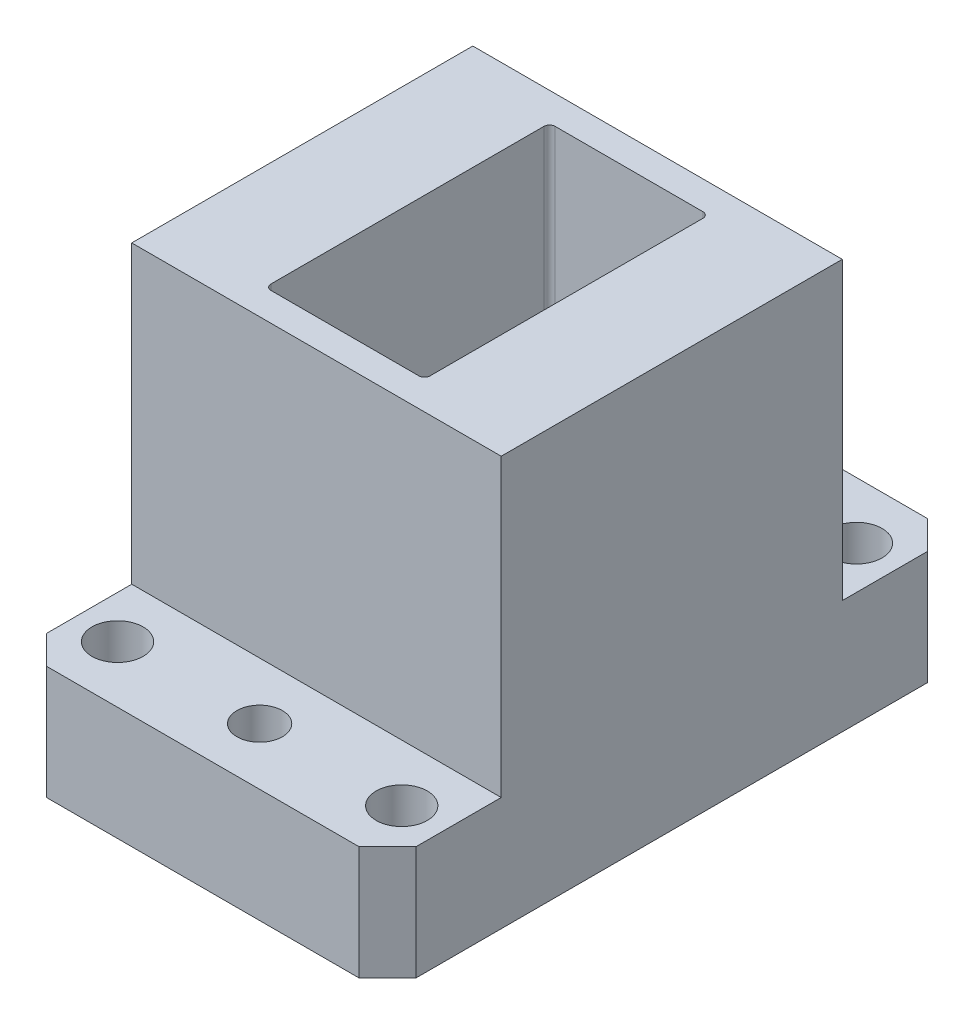
ISO-10303-21;
HEADER;
FILE_DESCRIPTION(('STEP AP214'),'2;1');
FILE_NAME('part.step','',(''),(''),'','','');
FILE_SCHEMA(('AUTOMOTIVE_DESIGN { 1 0 10303 214 1 1 1 1 }'));
ENDSEC;
DATA;
#1=APPLICATION_CONTEXT('core data for automotive mechanical design processes');
#2=APPLICATION_PROTOCOL_DEFINITION('international standard','automotive_design',2000,#1);
#3=PRODUCT_CONTEXT('',#1,'mechanical');
#4=PRODUCT('Part','Part','',(#3));
#5=PRODUCT_RELATED_PRODUCT_CATEGORY('part','',(#4));
#6=PRODUCT_DEFINITION_FORMATION('','',#4);
#7=PRODUCT_DEFINITION_CONTEXT('part definition',#1,'design');
#8=PRODUCT_DEFINITION('design','',#6,#7);
#9=PRODUCT_DEFINITION_SHAPE('','',#8);
#10=(LENGTH_UNIT() NAMED_UNIT(*) SI_UNIT(.MILLI.,.METRE.));
#11=(NAMED_UNIT(*) PLANE_ANGLE_UNIT() SI_UNIT($,.RADIAN.));
#12=(NAMED_UNIT(*) SI_UNIT($,.STERADIAN.) SOLID_ANGLE_UNIT());
#13=UNCERTAINTY_MEASURE_WITH_UNIT(LENGTH_MEASURE(1.E-05),#10,'distance_accuracy_value','');
#14=(GEOMETRIC_REPRESENTATION_CONTEXT(3) GLOBAL_UNCERTAINTY_ASSIGNED_CONTEXT((#13)) GLOBAL_UNIT_ASSIGNED_CONTEXT((#10,
#11,#12)) REPRESENTATION_CONTEXT('',''));
#15=CARTESIAN_POINT('',(0.,0.,0.));
#16=DIRECTION('',(0.,0.,1.));
#17=DIRECTION('',(1.,0.,0.));
#18=AXIS2_PLACEMENT_3D('',#15,#16,#17);
#19=CARTESIAN_POINT('',(-32.5,-16.,-50.));
#20=DIRECTION('',(0.,-1.,0.));
#21=DIRECTION('',(0.,0.,-1.));
#22=AXIS2_PLACEMENT_3D('',#19,#20,#21);
#23=PLANE('',#22);
#24=CARTESIAN_POINT('',(0.,-16.,-40.));
#25=DIRECTION('',(0.,1.,0.));
#26=DIRECTION('',(0.,0.,1.));
#27=AXIS2_PLACEMENT_3D('',#24,#25,#26);
#28=CIRCLE('',#27,4.);
#29=CARTESIAN_POINT('',(0.,-16.,-36.));
#30=VERTEX_POINT('',#29);
#31=EDGE_CURVE('E523',#30,#30,#28,.T.);
#32=ORIENTED_EDGE('',*,*,#31,.F.);
#33=EDGE_LOOP('',(#32));
#34=FACE_BOUND('',#33,.T.);
#35=CARTESIAN_POINT('',(-25.,-16.,-40.));
#36=DIRECTION('',(0.,1.,0.));
#37=DIRECTION('',(0.,0.,1.));
#38=AXIS2_PLACEMENT_3D('',#35,#36,#37);
#39=CIRCLE('',#38,4.49999999999999);
#40=CARTESIAN_POINT('',(-25.,-16.,-35.5));
#41=VERTEX_POINT('',#40);
#42=EDGE_CURVE('E514',#41,#41,#39,.T.);
#43=ORIENTED_EDGE('',*,*,#42,.F.);
#44=EDGE_LOOP('',(#43));
#45=FACE_BOUND('',#44,.T.);
#46=DIRECTION('',(-1.,0.,0.));
#47=VECTOR('',#46,1.);
#48=CARTESIAN_POINT('',(32.5,-16.,-50.));
#49=LINE('',#48,#47);
#50=CARTESIAN_POINT('',(27.5,-16.,-50.));
#51=VERTEX_POINT('',#50);
#52=CARTESIAN_POINT('',(-27.5,-16.,-50.));
#53=VERTEX_POINT('',#52);
#54=EDGE_CURVE('E185',#51,#53,#49,.T.);
#55=ORIENTED_EDGE('',*,*,#54,.T.);
#56=DIRECTION('',(0.70710678118655,0.,-0.707106781186546));
#57=VECTOR('',#56,1.);
#58=CARTESIAN_POINT('',(-32.5,-16.,-45.));
#59=LINE('',#58,#57);
#60=CARTESIAN_POINT('',(-32.5,-16.,-45.));
#61=VERTEX_POINT('',#60);
#62=EDGE_CURVE('E180',#53,#61,#59,.F.);
#63=ORIENTED_EDGE('',*,*,#62,.T.);
#64=DIRECTION('',(0.,0.,1.));
#65=VECTOR('',#64,1.);
#66=CARTESIAN_POINT('',(-32.5,-16.,-30.));
#67=LINE('',#66,#65);
#68=CARTESIAN_POINT('',(-32.5,-16.,-30.));
#69=VERTEX_POINT('',#68);
#70=EDGE_CURVE('E172',#61,#69,#67,.T.);
#71=ORIENTED_EDGE('',*,*,#70,.T.);
#72=DIRECTION('',(1.,0.,0.));
#73=VECTOR('',#72,1.);
#74=CARTESIAN_POINT('',(-32.5,-16.,-30.));
#75=LINE('',#74,#73);
#76=CARTESIAN_POINT('',(32.5,-16.,-30.));
#77=VERTEX_POINT('',#76);
#78=EDGE_CURVE('E177',#69,#77,#75,.T.);
#79=ORIENTED_EDGE('',*,*,#78,.T.);
#80=DIRECTION('',(0.,0.,-1.));
#81=VECTOR('',#80,1.);
#82=CARTESIAN_POINT('',(32.5,-16.,-30.));
#83=LINE('',#82,#81);
#84=CARTESIAN_POINT('',(32.5,-16.,-45.));
#85=VERTEX_POINT('',#84);
#86=EDGE_CURVE('E193',#77,#85,#83,.T.);
#87=ORIENTED_EDGE('',*,*,#86,.T.);
#88=DIRECTION('',(0.70710678118655,0.,0.707106781186546));
#89=VECTOR('',#88,1.);
#90=CARTESIAN_POINT('',(32.5,-16.,-45.));
#91=LINE('',#90,#89);
#92=EDGE_CURVE('E275',#85,#51,#91,.F.);
#93=ORIENTED_EDGE('',*,*,#92,.T.);
#94=EDGE_LOOP('',(#55,#63,#71,#79,#87,#93));
#95=FACE_BOUND('',#94,.T.);
#96=CARTESIAN_POINT('',(25.,-16.,-40.));
#97=DIRECTION('',(0.,1.,0.));
#98=DIRECTION('',(0.,0.,1.));
#99=AXIS2_PLACEMENT_3D('',#96,#97,#98);
#100=CIRCLE('',#99,4.49999999999999);
#101=CARTESIAN_POINT('',(25.,-16.,-35.5));
#102=VERTEX_POINT('',#101);
#103=EDGE_CURVE('E471',#102,#102,#100,.T.);
#104=ORIENTED_EDGE('',*,*,#103,.F.);
#105=EDGE_LOOP('',(#104));
#106=FACE_BOUND('',#105,.T.);
#107=ADVANCED_FACE('F34',(#34,#45,#95,#106),#23,.F.);
#108=CARTESIAN_POINT('',(-32.5,-16.,30.));
#109=DIRECTION('',(0.,-1.,0.));
#110=DIRECTION('',(0.,0.,-1.));
#111=AXIS2_PLACEMENT_3D('',#108,#109,#110);
#112=PLANE('',#111);
#113=CARTESIAN_POINT('',(0.,-16.,40.));
#114=DIRECTION('',(0.,1.,0.));
#115=DIRECTION('',(0.,0.,1.));
#116=AXIS2_PLACEMENT_3D('',#113,#114,#115);
#117=CIRCLE('',#116,4.);
#118=CARTESIAN_POINT('',(0.,-16.,44.));
#119=VERTEX_POINT('',#118);
#120=EDGE_CURVE('E517',#119,#119,#117,.T.);
#121=ORIENTED_EDGE('',*,*,#120,.F.);
#122=EDGE_LOOP('',(#121));
#123=FACE_BOUND('',#122,.T.);
#124=CARTESIAN_POINT('',(25.,-16.,40.));
#125=DIRECTION('',(0.,1.,0.));
#126=DIRECTION('',(0.,0.,1.));
#127=AXIS2_PLACEMENT_3D('',#124,#125,#126);
#128=CIRCLE('',#127,4.49999999999999);
#129=CARTESIAN_POINT('',(25.,-16.,44.5));
#130=VERTEX_POINT('',#129);
#131=EDGE_CURVE('E464',#130,#130,#128,.T.);
#132=ORIENTED_EDGE('',*,*,#131,.F.);
#133=EDGE_LOOP('',(#132));
#134=FACE_BOUND('',#133,.T.);
#135=DIRECTION('',(0.,0.,1.));
#136=VECTOR('',#135,1.);
#137=CARTESIAN_POINT('',(-32.5,-16.,50.));
#138=LINE('',#137,#136);
#139=CARTESIAN_POINT('',(-32.5,-16.,30.));
#140=VERTEX_POINT('',#139);
#141=CARTESIAN_POINT('',(-32.5,-16.,45.));
#142=VERTEX_POINT('',#141);
#143=EDGE_CURVE('E206',#140,#142,#138,.T.);
#144=ORIENTED_EDGE('',*,*,#143,.T.);
#145=DIRECTION('',(0.707106781186546,0.,0.70710678118655));
#146=VECTOR('',#145,1.);
#147=CARTESIAN_POINT('',(-27.5,-16.,50.));
#148=LINE('',#147,#146);
#149=CARTESIAN_POINT('',(-27.5,-16.,50.));
#150=VERTEX_POINT('',#149);
#151=EDGE_CURVE('E291',#142,#150,#148,.T.);
#152=ORIENTED_EDGE('',*,*,#151,.T.);
#153=DIRECTION('',(1.,0.,0.));
#154=VECTOR('',#153,1.);
#155=CARTESIAN_POINT('',(-32.5,-16.,50.));
#156=LINE('',#155,#154);
#157=CARTESIAN_POINT('',(27.5,-16.,50.));
#158=VERTEX_POINT('',#157);
#159=EDGE_CURVE('E209',#150,#158,#156,.T.);
#160=ORIENTED_EDGE('',*,*,#159,.T.);
#161=DIRECTION('',(0.707106781186546,0.,-0.70710678118655));
#162=VECTOR('',#161,1.);
#163=CARTESIAN_POINT('',(27.5,-16.,50.));
#164=LINE('',#163,#162);
#165=CARTESIAN_POINT('',(32.5,-16.,45.));
#166=VERTEX_POINT('',#165);
#167=EDGE_CURVE('E289',#158,#166,#164,.T.);
#168=ORIENTED_EDGE('',*,*,#167,.T.);
#169=DIRECTION('',(0.,0.,-1.));
#170=VECTOR('',#169,1.);
#171=CARTESIAN_POINT('',(32.5,-16.,50.));
#172=LINE('',#171,#170);
#173=CARTESIAN_POINT('',(32.5,-16.,30.));
#174=VERTEX_POINT('',#173);
#175=EDGE_CURVE('E212',#166,#174,#172,.T.);
#176=ORIENTED_EDGE('',*,*,#175,.T.);
#177=DIRECTION('',(-1.,0.,0.));
#178=VECTOR('',#177,1.);
#179=CARTESIAN_POINT('',(-32.5,-16.,30.));
#180=LINE('',#179,#178);
#181=EDGE_CURVE('E214',#174,#140,#180,.T.);
#182=ORIENTED_EDGE('',*,*,#181,.T.);
#183=EDGE_LOOP('',(#144,#152,#160,#168,#176,#182));
#184=FACE_BOUND('',#183,.T.);
#185=CARTESIAN_POINT('',(-25.,-16.,40.));
#186=DIRECTION('',(0.,1.,0.));
#187=DIRECTION('',(0.,0.,1.));
#188=AXIS2_PLACEMENT_3D('',#185,#186,#187);
#189=CIRCLE('',#188,4.49999999999999);
#190=CARTESIAN_POINT('',(-25.,-16.,44.5));
#191=VERTEX_POINT('',#190);
#192=EDGE_CURVE('E468',#191,#191,#189,.T.);
#193=ORIENTED_EDGE('',*,*,#192,.F.);
#194=EDGE_LOOP('',(#193));
#195=FACE_BOUND('',#194,.T.);
#196=ADVANCED_FACE('F365',(#123,#134,#184,#195),#112,.F.);
#197=CARTESIAN_POINT('',(-32.5,36.,50.));
#198=DIRECTION('',(1.,0.,0.));
#199=DIRECTION('',(0.,1.,0.));
#200=AXIS2_PLACEMENT_3D('',#197,#198,#199);
#201=PLANE('',#200);
#202=ORIENTED_EDGE('',*,*,#70,.F.);
#203=DIRECTION('',(0.,-1.,0.));
#204=VECTOR('',#203,1.);
#205=CARTESIAN_POINT('',(-32.5,36.,-45.));
#206=LINE('',#205,#204);
#207=CARTESIAN_POINT('',(-32.5,-36.,-45.));
#208=VERTEX_POINT('',#207);
#209=EDGE_CURVE('E261',#61,#208,#206,.T.);
#210=ORIENTED_EDGE('',*,*,#209,.T.);
#211=DIRECTION('',(0.,0.,-1.));
#212=VECTOR('',#211,1.);
#213=CARTESIAN_POINT('',(-32.5,-36.,50.));
#214=LINE('',#213,#212);
#215=CARTESIAN_POINT('',(-32.5,-36.,45.));
#216=VERTEX_POINT('',#215);
#217=EDGE_CURVE('E256',#216,#208,#214,.T.);
#218=ORIENTED_EDGE('',*,*,#217,.F.);
#219=DIRECTION('',(0.,1.,0.));
#220=VECTOR('',#219,1.);
#221=CARTESIAN_POINT('',(-32.5,-16.,45.));
#222=LINE('',#221,#220);
#223=EDGE_CURVE('E259',#216,#142,#222,.T.);
#224=ORIENTED_EDGE('',*,*,#223,.T.);
#225=ORIENTED_EDGE('',*,*,#143,.F.);
#226=DIRECTION('',(0.,1.,0.));
#227=VECTOR('',#226,1.);
#228=CARTESIAN_POINT('',(-32.5,-16.,30.));
#229=LINE('',#228,#227);
#230=CARTESIAN_POINT('',(-32.5,36.,30.));
#231=VERTEX_POINT('',#230);
#232=EDGE_CURVE('E219',#140,#231,#229,.T.);
#233=ORIENTED_EDGE('',*,*,#232,.T.);
#234=DIRECTION('',(0.,0.,-1.));
#235=VECTOR('',#234,1.);
#236=CARTESIAN_POINT('',(-32.5,36.,50.));
#237=LINE('',#236,#235);
#238=CARTESIAN_POINT('',(-32.5,36.,-30.));
#239=VERTEX_POINT('',#238);
#240=EDGE_CURVE('E199',#231,#239,#237,.T.);
#241=ORIENTED_EDGE('',*,*,#240,.T.);
#242=DIRECTION('',(0.,1.,0.));
#243=VECTOR('',#242,1.);
#244=CARTESIAN_POINT('',(-32.5,-16.,-30.));
#245=LINE('',#244,#243);
#246=EDGE_CURVE('E189',#69,#239,#245,.T.);
#247=ORIENTED_EDGE('',*,*,#246,.F.);
#248=EDGE_LOOP('',(#202,#210,#218,#224,#225,#233,#241,#247));
#249=FACE_BOUND('',#248,.T.);
#250=ADVANCED_FACE('F196',(#249),#201,.F.);
#251=CARTESIAN_POINT('',(-32.5,-36.,50.));
#252=DIRECTION('',(0.,1.,0.));
#253=DIRECTION('',(0.,0.,1.));
#254=AXIS2_PLACEMENT_3D('',#251,#252,#253);
#255=PLANE('',#254);
#256=CARTESIAN_POINT('',(0.,-36.,-40.));
#257=DIRECTION('',(0.,1.,0.));
#258=DIRECTION('',(0.,0.,1.));
#259=AXIS2_PLACEMENT_3D('',#256,#257,#258);
#260=CIRCLE('',#259,4.);
#261=CARTESIAN_POINT('',(0.,-36.,-36.));
#262=VERTEX_POINT('',#261);
#263=EDGE_CURVE('E526',#262,#262,#260,.T.);
#264=ORIENTED_EDGE('',*,*,#263,.T.);
#265=EDGE_LOOP('',(#264));
#266=FACE_BOUND('',#265,.T.);
#267=CARTESIAN_POINT('',(0.,-36.,40.));
#268=DIRECTION('',(0.,1.,0.));
#269=DIRECTION('',(0.,0.,1.));
#270=AXIS2_PLACEMENT_3D('',#267,#268,#269);
#271=CIRCLE('',#270,4.);
#272=CARTESIAN_POINT('',(0.,-36.,44.));
#273=VERTEX_POINT('',#272);
#274=EDGE_CURVE('E520',#273,#273,#271,.T.);
#275=ORIENTED_EDGE('',*,*,#274,.T.);
#276=EDGE_LOOP('',(#275));
#277=FACE_BOUND('',#276,.T.);
#278=CARTESIAN_POINT('',(-25.,-36.,-40.));
#279=DIRECTION('',(0.,1.,0.));
#280=DIRECTION('',(0.,0.,1.));
#281=AXIS2_PLACEMENT_3D('',#278,#279,#280);
#282=CIRCLE('',#281,4.49999999999999);
#283=CARTESIAN_POINT('',(-25.,-36.,-35.5));
#284=VERTEX_POINT('',#283);
#285=EDGE_CURVE('E511',#284,#284,#282,.T.);
#286=ORIENTED_EDGE('',*,*,#285,.T.);
#287=EDGE_LOOP('',(#286));
#288=FACE_BOUND('',#287,.T.);
#289=CARTESIAN_POINT('',(25.,-36.,-40.));
#290=DIRECTION('',(0.,1.,0.));
#291=DIRECTION('',(0.,0.,1.));
#292=AXIS2_PLACEMENT_3D('',#289,#290,#291);
#293=CIRCLE('',#292,4.49999999999999);
#294=CARTESIAN_POINT('',(25.,-36.,-35.5));
#295=VERTEX_POINT('',#294);
#296=EDGE_CURVE('E466',#295,#295,#293,.T.);
#297=ORIENTED_EDGE('',*,*,#296,.T.);
#298=EDGE_LOOP('',(#297));
#299=FACE_BOUND('',#298,.T.);
#300=CARTESIAN_POINT('',(25.,-36.,40.));
#301=DIRECTION('',(0.,1.,0.));
#302=DIRECTION('',(0.,0.,1.));
#303=AXIS2_PLACEMENT_3D('',#300,#301,#302);
#304=CIRCLE('',#303,4.49999999999999);
#305=CARTESIAN_POINT('',(25.,-36.,44.5));
#306=VERTEX_POINT('',#305);
#307=EDGE_CURVE('E461',#306,#306,#304,.T.);
#308=ORIENTED_EDGE('',*,*,#307,.T.);
#309=EDGE_LOOP('',(#308));
#310=FACE_BOUND('',#309,.T.);
#311=CARTESIAN_POINT('',(-25.,-36.,40.));
#312=DIRECTION('',(0.,1.,0.));
#313=DIRECTION('',(0.,0.,1.));
#314=AXIS2_PLACEMENT_3D('',#311,#312,#313);
#315=CIRCLE('',#314,4.49999999999999);
#316=CARTESIAN_POINT('',(-25.,-36.,44.5));
#317=VERTEX_POINT('',#316);
#318=EDGE_CURVE('E477',#317,#317,#315,.T.);
#319=ORIENTED_EDGE('',*,*,#318,.T.);
#320=EDGE_LOOP('',(#319));
#321=FACE_BOUND('',#320,.T.);
#322=DIRECTION('',(0.,0.,-1.));
#323=VECTOR('',#322,1.);
#324=CARTESIAN_POINT('',(13.9999999999999,-36.,-25.));
#325=LINE('',#324,#323);
#326=CARTESIAN_POINT('',(14.0000000000001,-36.,24.));
#327=VERTEX_POINT('',#326);
#328=CARTESIAN_POINT('',(13.9999999999999,-36.,-24.));
#329=VERTEX_POINT('',#328);
#330=EDGE_CURVE('E229',#327,#329,#325,.T.);
#331=ORIENTED_EDGE('',*,*,#330,.T.);
#332=CARTESIAN_POINT('',(12.9999999999999,-36.,-24.));
#333=DIRECTION('',(0.,1.,0.));
#334=DIRECTION('',(0.,0.,1.));
#335=AXIS2_PLACEMENT_3D('',#332,#333,#334);
#336=CIRCLE('',#335,1.);
#337=CARTESIAN_POINT('',(12.9999999999999,-36.,-25.));
#338=VERTEX_POINT('',#337);
#339=EDGE_CURVE('E314',#329,#338,#336,.T.);
#340=ORIENTED_EDGE('',*,*,#339,.T.);
#341=DIRECTION('',(-1.,0.,0.));
#342=VECTOR('',#341,1.);
#343=CARTESIAN_POINT('',(-14.0000000000001,-36.,-25.));
#344=LINE('',#343,#342);
#345=CARTESIAN_POINT('',(-13.0000000000001,-36.,-25.));
#346=VERTEX_POINT('',#345);
#347=EDGE_CURVE('E232',#338,#346,#344,.T.);
#348=ORIENTED_EDGE('',*,*,#347,.T.);
#349=CARTESIAN_POINT('',(-13.0000000000001,-36.,-24.));
#350=DIRECTION('',(0.,1.,0.));
#351=DIRECTION('',(0.,0.,1.));
#352=AXIS2_PLACEMENT_3D('',#349,#350,#351);
#353=CIRCLE('',#352,1.);
#354=CARTESIAN_POINT('',(-14.0000000000001,-36.,-24.));
#355=VERTEX_POINT('',#354);
#356=EDGE_CURVE('E56',#346,#355,#353,.T.);
#357=ORIENTED_EDGE('',*,*,#356,.T.);
#358=DIRECTION('',(0.,0.,1.));
#359=VECTOR('',#358,1.);
#360=CARTESIAN_POINT('',(-14.0000000000001,-36.,-25.));
#361=LINE('',#360,#359);
#362=CARTESIAN_POINT('',(-14.0000000000001,-36.,24.));
#363=VERTEX_POINT('',#362);
#364=EDGE_CURVE('E223',#355,#363,#361,.T.);
#365=ORIENTED_EDGE('',*,*,#364,.T.);
#366=CARTESIAN_POINT('',(-13.0000000000001,-36.,24.));
#367=DIRECTION('',(0.,1.,0.));
#368=DIRECTION('',(0.,0.,1.));
#369=AXIS2_PLACEMENT_3D('',#366,#367,#368);
#370=CIRCLE('',#369,1.);
#371=CARTESIAN_POINT('',(-13.0000000000001,-36.,25.));
#372=VERTEX_POINT('',#371);
#373=EDGE_CURVE('E11',#363,#372,#370,.T.);
#374=ORIENTED_EDGE('',*,*,#373,.T.);
#375=DIRECTION('',(1.,0.,0.));
#376=VECTOR('',#375,1.);
#377=CARTESIAN_POINT('',(-14.0000000000001,-36.,25.));
#378=LINE('',#377,#376);
#379=CARTESIAN_POINT('',(13.0000000000001,-36.,25.));
#380=VERTEX_POINT('',#379);
#381=EDGE_CURVE('E225',#372,#380,#378,.T.);
#382=ORIENTED_EDGE('',*,*,#381,.T.);
#383=CARTESIAN_POINT('',(13.0000000000001,-36.,24.));
#384=DIRECTION('',(0.,1.,0.));
#385=DIRECTION('',(0.,0.,1.));
#386=AXIS2_PLACEMENT_3D('',#383,#384,#385);
#387=CIRCLE('',#386,1.);
#388=EDGE_CURVE('E318',#380,#327,#387,.T.);
#389=ORIENTED_EDGE('',*,*,#388,.T.);
#390=EDGE_LOOP('',(#331,#340,#348,#357,#365,#374,#382,#389));
#391=FACE_BOUND('',#390,.T.);
#392=ORIENTED_EDGE('',*,*,#217,.T.);
#393=DIRECTION('',(-0.70710678118655,0.,0.707106781186546));
#394=VECTOR('',#393,1.);
#395=CARTESIAN_POINT('',(-32.5,-36.,-45.));
#396=LINE('',#395,#394);
#397=CARTESIAN_POINT('',(-27.5,-36.,-50.));
#398=VERTEX_POINT('',#397);
#399=EDGE_CURVE('E269',#208,#398,#396,.F.);
#400=ORIENTED_EDGE('',*,*,#399,.T.);
#401=DIRECTION('',(1.,0.,0.));
#402=VECTOR('',#401,1.);
#403=CARTESIAN_POINT('',(-32.5,-36.,-50.));
#404=LINE('',#403,#402);
#405=CARTESIAN_POINT('',(27.5,-36.,-50.));
#406=VERTEX_POINT('',#405);
#407=EDGE_CURVE('E234',#398,#406,#404,.T.);
#408=ORIENTED_EDGE('',*,*,#407,.T.);
#409=DIRECTION('',(-0.70710678118655,0.,-0.707106781186546));
#410=VECTOR('',#409,1.);
#411=CARTESIAN_POINT('',(32.5,-36.,-45.));
#412=LINE('',#411,#410);
#413=CARTESIAN_POINT('',(32.5,-36.,-45.));
#414=VERTEX_POINT('',#413);
#415=EDGE_CURVE('E267',#406,#414,#412,.F.);
#416=ORIENTED_EDGE('',*,*,#415,.T.);
#417=DIRECTION('',(0.,0.,-1.));
#418=VECTOR('',#417,1.);
#419=CARTESIAN_POINT('',(32.5,-36.,50.));
#420=LINE('',#419,#418);
#421=CARTESIAN_POINT('',(32.5,-36.,45.));
#422=VERTEX_POINT('',#421);
#423=EDGE_CURVE('E253',#422,#414,#420,.T.);
#424=ORIENTED_EDGE('',*,*,#423,.F.);
#425=DIRECTION('',(-0.707106781186546,0.,0.70710678118655));
#426=VECTOR('',#425,1.);
#427=CARTESIAN_POINT('',(27.5,-36.,50.));
#428=LINE('',#427,#426);
#429=CARTESIAN_POINT('',(27.5,-36.,50.));
#430=VERTEX_POINT('',#429);
#431=EDGE_CURVE('E263',#422,#430,#428,.T.);
#432=ORIENTED_EDGE('',*,*,#431,.T.);
#433=DIRECTION('',(1.,0.,0.));
#434=VECTOR('',#433,1.);
#435=CARTESIAN_POINT('',(-32.5,-36.,50.));
#436=LINE('',#435,#434);
#437=CARTESIAN_POINT('',(-27.5,-36.,50.));
#438=VERTEX_POINT('',#437);
#439=EDGE_CURVE('E244',#438,#430,#436,.T.);
#440=ORIENTED_EDGE('',*,*,#439,.F.);
#441=DIRECTION('',(-0.707106781186546,0.,-0.70710678118655));
#442=VECTOR('',#441,1.);
#443=CARTESIAN_POINT('',(-27.5,-36.,50.));
#444=LINE('',#443,#442);
#445=EDGE_CURVE('E265',#438,#216,#444,.T.);
#446=ORIENTED_EDGE('',*,*,#445,.T.);
#447=EDGE_LOOP('',(#392,#400,#408,#416,#424,#432,#440,#446));
#448=FACE_BOUND('',#447,.T.);
#449=ADVANCED_FACE('F333',(#266,#277,#288,#299,#310,#321,#391,#448),#255,.F.);
#450=CARTESIAN_POINT('',(32.5,36.,50.));
#451=DIRECTION('',(-1.,0.,0.));
#452=DIRECTION('',(0.,-1.,0.));
#453=AXIS2_PLACEMENT_3D('',#450,#451,#452);
#454=PLANE('',#453);
#455=ORIENTED_EDGE('',*,*,#423,.T.);
#456=DIRECTION('',(0.,1.,0.));
#457=VECTOR('',#456,1.);
#458=CARTESIAN_POINT('',(32.5,36.,-45.));
#459=LINE('',#458,#457);
#460=EDGE_CURVE('E280',#414,#85,#459,.T.);
#461=ORIENTED_EDGE('',*,*,#460,.T.);
#462=ORIENTED_EDGE('',*,*,#86,.F.);
#463=DIRECTION('',(0.,1.,0.));
#464=VECTOR('',#463,1.);
#465=CARTESIAN_POINT('',(32.5,-16.,-30.));
#466=LINE('',#465,#464);
#467=CARTESIAN_POINT('',(32.5,36.,-30.));
#468=VERTEX_POINT('',#467);
#469=EDGE_CURVE('E192',#77,#468,#466,.T.);
#470=ORIENTED_EDGE('',*,*,#469,.T.);
#471=DIRECTION('',(0.,0.,-1.));
#472=VECTOR('',#471,1.);
#473=CARTESIAN_POINT('',(32.5,36.,50.));
#474=LINE('',#473,#472);
#475=CARTESIAN_POINT('',(32.5,36.,30.));
#476=VERTEX_POINT('',#475);
#477=EDGE_CURVE('E250',#476,#468,#474,.T.);
#478=ORIENTED_EDGE('',*,*,#477,.F.);
#479=DIRECTION('',(0.,1.,0.));
#480=VECTOR('',#479,1.);
#481=CARTESIAN_POINT('',(32.5,-16.,30.));
#482=LINE('',#481,#480);
#483=EDGE_CURVE('E217',#174,#476,#482,.T.);
#484=ORIENTED_EDGE('',*,*,#483,.F.);
#485=ORIENTED_EDGE('',*,*,#175,.F.);
#486=DIRECTION('',(0.,-1.,0.));
#487=VECTOR('',#486,1.);
#488=CARTESIAN_POINT('',(32.5,-36.,45.));
#489=LINE('',#488,#487);
#490=EDGE_CURVE('E278',#166,#422,#489,.T.);
#491=ORIENTED_EDGE('',*,*,#490,.T.);
#492=EDGE_LOOP('',(#455,#461,#462,#470,#478,#484,#485,#491));
#493=FACE_BOUND('',#492,.T.);
#494=ADVANCED_FACE('F404',(#493),#454,.F.);
#495=CARTESIAN_POINT('',(-32.5,36.,50.));
#496=DIRECTION('',(0.,-1.,0.));
#497=DIRECTION('',(0.,0.,-1.));
#498=AXIS2_PLACEMENT_3D('',#495,#496,#497);
#499=PLANE('',#498);
#500=DIRECTION('',(1.,0.,0.));
#501=VECTOR('',#500,1.);
#502=CARTESIAN_POINT('',(-14.0000000000001,36.,25.));
#503=LINE('',#502,#501);
#504=CARTESIAN_POINT('',(-13.0000000000001,36.,25.));
#505=VERTEX_POINT('',#504);
#506=CARTESIAN_POINT('',(13.0000000000001,36.,25.));
#507=VERTEX_POINT('',#506);
#508=EDGE_CURVE('E236',#505,#507,#503,.T.);
#509=ORIENTED_EDGE('',*,*,#508,.F.);
#510=CARTESIAN_POINT('',(-13.0000000000001,36.,24.));
#511=DIRECTION('',(0.,-1.,0.));
#512=DIRECTION('',(0.,0.,-1.));
#513=AXIS2_PLACEMENT_3D('',#510,#511,#512);
#514=CIRCLE('',#513,1.);
#515=CARTESIAN_POINT('',(-14.0000000000001,36.,24.));
#516=VERTEX_POINT('',#515);
#517=EDGE_CURVE('E42',#505,#516,#514,.T.);
#518=ORIENTED_EDGE('',*,*,#517,.T.);
#519=DIRECTION('',(0.,0.,1.));
#520=VECTOR('',#519,1.);
#521=CARTESIAN_POINT('',(-14.0000000000001,36.,-25.));
#522=LINE('',#521,#520);
#523=CARTESIAN_POINT('',(-14.0000000000001,36.,-24.));
#524=VERTEX_POINT('',#523);
#525=EDGE_CURVE('E221',#524,#516,#522,.T.);
#526=ORIENTED_EDGE('',*,*,#525,.F.);
#527=CARTESIAN_POINT('',(-13.0000000000001,36.,-24.));
#528=DIRECTION('',(0.,-1.,0.));
#529=DIRECTION('',(0.,0.,-1.));
#530=AXIS2_PLACEMENT_3D('',#527,#528,#529);
#531=CIRCLE('',#530,1.);
#532=CARTESIAN_POINT('',(-13.0000000000001,36.,-25.));
#533=VERTEX_POINT('',#532);
#534=EDGE_CURVE('E320',#524,#533,#531,.T.);
#535=ORIENTED_EDGE('',*,*,#534,.T.);
#536=DIRECTION('',(-1.,0.,0.));
#537=VECTOR('',#536,1.);
#538=CARTESIAN_POINT('',(-14.0000000000001,36.,-25.));
#539=LINE('',#538,#537);
#540=CARTESIAN_POINT('',(12.9999999999999,36.,-25.));
#541=VERTEX_POINT('',#540);
#542=EDGE_CURVE('E226',#541,#533,#539,.T.);
#543=ORIENTED_EDGE('',*,*,#542,.F.);
#544=CARTESIAN_POINT('',(12.9999999999999,36.,-24.));
#545=DIRECTION('',(0.,-1.,0.));
#546=DIRECTION('',(0.,0.,-1.));
#547=AXIS2_PLACEMENT_3D('',#544,#545,#546);
#548=CIRCLE('',#547,1.);
#549=CARTESIAN_POINT('',(13.9999999999999,36.,-24.));
#550=VERTEX_POINT('',#549);
#551=EDGE_CURVE('E312',#541,#550,#548,.T.);
#552=ORIENTED_EDGE('',*,*,#551,.T.);
#553=DIRECTION('',(0.,0.,-1.));
#554=VECTOR('',#553,1.);
#555=CARTESIAN_POINT('',(13.9999999999999,36.,-25.));
#556=LINE('',#555,#554);
#557=CARTESIAN_POINT('',(14.0000000000001,36.,24.));
#558=VERTEX_POINT('',#557);
#559=EDGE_CURVE('E239',#558,#550,#556,.T.);
#560=ORIENTED_EDGE('',*,*,#559,.F.);
#561=CARTESIAN_POINT('',(13.0000000000001,36.,24.));
#562=DIRECTION('',(0.,-1.,0.));
#563=DIRECTION('',(0.,0.,-1.));
#564=AXIS2_PLACEMENT_3D('',#561,#562,#563);
#565=CIRCLE('',#564,1.);
#566=EDGE_CURVE('E316',#558,#507,#565,.T.);
#567=ORIENTED_EDGE('',*,*,#566,.T.);
#568=EDGE_LOOP('',(#509,#518,#526,#535,#543,#552,#560,#567));
#569=FACE_BOUND('',#568,.T.);
#570=ORIENTED_EDGE('',*,*,#477,.T.);
#571=DIRECTION('',(1.,0.,0.));
#572=VECTOR('',#571,1.);
#573=CARTESIAN_POINT('',(-32.5,36.,-30.));
#574=LINE('',#573,#572);
#575=EDGE_CURVE('E480',#239,#468,#574,.T.);
#576=ORIENTED_EDGE('',*,*,#575,.F.);
#577=ORIENTED_EDGE('',*,*,#240,.F.);
#578=DIRECTION('',(-1.,0.,0.));
#579=VECTOR('',#578,1.);
#580=CARTESIAN_POINT('',(-32.5,36.,30.));
#581=LINE('',#580,#579);
#582=EDGE_CURVE('E201',#476,#231,#581,.T.);
#583=ORIENTED_EDGE('',*,*,#582,.F.);
#584=EDGE_LOOP('',(#570,#576,#577,#583));
#585=FACE_BOUND('',#584,.T.);
#586=ADVANCED_FACE('F325',(#569,#585),#499,.F.);
#587=CARTESIAN_POINT('',(-32.5,-36.,50.));
#588=DIRECTION('',(0.,0.,1.));
#589=DIRECTION('',(1.,0.,0.));
#590=AXIS2_PLACEMENT_3D('',#587,#588,#589);
#591=PLANE('',#590);
#592=ORIENTED_EDGE('',*,*,#159,.F.);
#593=DIRECTION('',(0.,-1.,0.));
#594=VECTOR('',#593,1.);
#595=CARTESIAN_POINT('',(-27.5,-36.,50.));
#596=LINE('',#595,#594);
#597=EDGE_CURVE('E286',#150,#438,#596,.T.);
#598=ORIENTED_EDGE('',*,*,#597,.T.);
#599=ORIENTED_EDGE('',*,*,#439,.T.);
#600=DIRECTION('',(0.,1.,0.));
#601=VECTOR('',#600,1.);
#602=CARTESIAN_POINT('',(27.5,-16.,50.));
#603=LINE('',#602,#601);
#604=EDGE_CURVE('E283',#430,#158,#603,.T.);
#605=ORIENTED_EDGE('',*,*,#604,.T.);
#606=EDGE_LOOP('',(#592,#598,#599,#605));
#607=FACE_BOUND('',#606,.T.);
#608=ADVANCED_FACE('F395',(#607),#591,.T.);
#609=CARTESIAN_POINT('',(-32.5,-36.,-50.));
#610=DIRECTION('',(0.,0.,1.));
#611=DIRECTION('',(1.,0.,0.));
#612=AXIS2_PLACEMENT_3D('',#609,#610,#611);
#613=PLANE('',#612);
#614=ORIENTED_EDGE('',*,*,#407,.F.);
#615=DIRECTION('',(0.,1.,0.));
#616=VECTOR('',#615,1.);
#617=CARTESIAN_POINT('',(-27.5,-36.,-50.));
#618=LINE('',#617,#616);
#619=EDGE_CURVE('E273',#398,#53,#618,.T.);
#620=ORIENTED_EDGE('',*,*,#619,.T.);
#621=ORIENTED_EDGE('',*,*,#54,.F.);
#622=DIRECTION('',(0.,-1.,0.));
#623=VECTOR('',#622,1.);
#624=CARTESIAN_POINT('',(27.5,-36.,-50.));
#625=LINE('',#624,#623);
#626=EDGE_CURVE('E271',#51,#406,#625,.T.);
#627=ORIENTED_EDGE('',*,*,#626,.T.);
#628=EDGE_LOOP('',(#614,#620,#621,#627));
#629=FACE_BOUND('',#628,.T.);
#630=ADVANCED_FACE('F394',(#629),#613,.F.);
#631=CARTESIAN_POINT('',(-14.0000000000001,-36.,-25.));
#632=DIRECTION('',(-1.,0.,0.));
#633=DIRECTION('',(0.,0.,1.));
#634=AXIS2_PLACEMENT_3D('',#631,#632,#633);
#635=PLANE('',#634);
#636=ORIENTED_EDGE('',*,*,#364,.F.);
#637=DIRECTION('',(0.,1.,0.));
#638=VECTOR('',#637,1.);
#639=CARTESIAN_POINT('',(-14.0000000000001,36.,-24.));
#640=LINE('',#639,#638);
#641=EDGE_CURVE('E309',#355,#524,#640,.T.);
#642=ORIENTED_EDGE('',*,*,#641,.T.);
#643=ORIENTED_EDGE('',*,*,#525,.T.);
#644=DIRECTION('',(0.,1.,0.));
#645=VECTOR('',#644,1.);
#646=CARTESIAN_POINT('',(-14.0000000000001,-36.,24.));
#647=LINE('',#646,#645);
#648=EDGE_CURVE('E49',#516,#363,#647,.F.);
#649=ORIENTED_EDGE('',*,*,#648,.T.);
#650=EDGE_LOOP('',(#636,#642,#643,#649));
#651=FACE_BOUND('',#650,.T.);
#652=ADVANCED_FACE('F329',(#651),#635,.F.);
#653=CARTESIAN_POINT('',(-14.0000000000001,-36.,-25.));
#654=DIRECTION('',(0.,0.,-1.));
#655=DIRECTION('',(-1.,0.,0.));
#656=AXIS2_PLACEMENT_3D('',#653,#654,#655);
#657=PLANE('',#656);
#658=ORIENTED_EDGE('',*,*,#347,.F.);
#659=DIRECTION('',(0.,1.,0.));
#660=VECTOR('',#659,1.);
#661=CARTESIAN_POINT('',(12.9999999999999,36.,-25.));
#662=LINE('',#661,#660);
#663=EDGE_CURVE('E295',#338,#541,#662,.T.);
#664=ORIENTED_EDGE('',*,*,#663,.T.);
#665=ORIENTED_EDGE('',*,*,#542,.T.);
#666=DIRECTION('',(0.,1.,0.));
#667=VECTOR('',#666,1.);
#668=CARTESIAN_POINT('',(-13.0000000000001,-36.,-25.));
#669=LINE('',#668,#667);
#670=EDGE_CURVE('E293',#533,#346,#669,.F.);
#671=ORIENTED_EDGE('',*,*,#670,.T.);
#672=EDGE_LOOP('',(#658,#664,#665,#671));
#673=FACE_BOUND('',#672,.T.);
#674=ADVANCED_FACE('F353',(#673),#657,.F.);
#675=CARTESIAN_POINT('',(13.9999999999999,-36.,-25.));
#676=DIRECTION('',(1.,0.,0.));
#677=DIRECTION('',(0.,0.,-1.));
#678=AXIS2_PLACEMENT_3D('',#675,#676,#677);
#679=PLANE('',#678);
#680=ORIENTED_EDGE('',*,*,#559,.T.);
#681=DIRECTION('',(0.,1.,0.));
#682=VECTOR('',#681,1.);
#683=CARTESIAN_POINT('',(13.9999999999999,-36.,-24.));
#684=LINE('',#683,#682);
#685=EDGE_CURVE('E301',#550,#329,#684,.F.);
#686=ORIENTED_EDGE('',*,*,#685,.T.);
#687=ORIENTED_EDGE('',*,*,#330,.F.);
#688=DIRECTION('',(0.,1.,0.));
#689=VECTOR('',#688,1.);
#690=CARTESIAN_POINT('',(14.0000000000001,36.,24.));
#691=LINE('',#690,#689);
#692=EDGE_CURVE('E298',#327,#558,#691,.T.);
#693=ORIENTED_EDGE('',*,*,#692,.T.);
#694=EDGE_LOOP('',(#680,#686,#687,#693));
#695=FACE_BOUND('',#694,.T.);
#696=ADVANCED_FACE('F345',(#695),#679,.F.);
#697=CARTESIAN_POINT('',(-14.0000000000001,-36.,25.));
#698=DIRECTION('',(0.,0.,1.));
#699=DIRECTION('',(1.,0.,0.));
#700=AXIS2_PLACEMENT_3D('',#697,#698,#699);
#701=PLANE('',#700);
#702=ORIENTED_EDGE('',*,*,#508,.T.);
#703=DIRECTION('',(0.,1.,0.));
#704=VECTOR('',#703,1.);
#705=CARTESIAN_POINT('',(13.0000000000001,-36.,25.));
#706=LINE('',#705,#704);
#707=EDGE_CURVE('E306',#507,#380,#706,.F.);
#708=ORIENTED_EDGE('',*,*,#707,.T.);
#709=ORIENTED_EDGE('',*,*,#381,.F.);
#710=DIRECTION('',(0.,1.,0.));
#711=VECTOR('',#710,1.);
#712=CARTESIAN_POINT('',(-13.0000000000001,36.,25.));
#713=LINE('',#712,#711);
#714=EDGE_CURVE('E303',#372,#505,#713,.T.);
#715=ORIENTED_EDGE('',*,*,#714,.T.);
#716=EDGE_LOOP('',(#702,#708,#709,#715));
#717=FACE_BOUND('',#716,.T.);
#718=ADVANCED_FACE('F337',(#717),#701,.F.);
#719=CARTESIAN_POINT('',(-32.5,-16.,30.));
#720=DIRECTION('',(0.,0.,-1.));
#721=DIRECTION('',(-1.,0.,0.));
#722=AXIS2_PLACEMENT_3D('',#719,#720,#721);
#723=PLANE('',#722);
#724=ORIENTED_EDGE('',*,*,#582,.T.);
#725=ORIENTED_EDGE('',*,*,#232,.F.);
#726=ORIENTED_EDGE('',*,*,#181,.F.);
#727=ORIENTED_EDGE('',*,*,#483,.T.);
#728=EDGE_LOOP('',(#724,#725,#726,#727));
#729=FACE_BOUND('',#728,.T.);
#730=ADVANCED_FACE('F381',(#729),#723,.F.);
#731=CARTESIAN_POINT('',(-32.5,-16.,-30.));
#732=DIRECTION('',(0.,0.,1.));
#733=DIRECTION('',(1.,0.,0.));
#734=AXIS2_PLACEMENT_3D('',#731,#732,#733);
#735=PLANE('',#734);
#736=ORIENTED_EDGE('',*,*,#575,.T.);
#737=ORIENTED_EDGE('',*,*,#469,.F.);
#738=ORIENTED_EDGE('',*,*,#78,.F.);
#739=ORIENTED_EDGE('',*,*,#246,.T.);
#740=EDGE_LOOP('',(#736,#737,#738,#739));
#741=FACE_BOUND('',#740,.T.);
#742=ADVANCED_FACE('F188',(#741),#735,.F.);
#743=CARTESIAN_POINT('',(-32.5,36.,-45.));
#744=DIRECTION('',(0.707106781186545,0.,0.707106781186549));
#745=DIRECTION('',(0.70710678118655,0.,-0.707106781186546));
#746=AXIS2_PLACEMENT_3D('',#743,#744,#745);
#747=PLANE('',#746);
#748=ORIENTED_EDGE('',*,*,#62,.F.);
#749=ORIENTED_EDGE('',*,*,#619,.F.);
#750=ORIENTED_EDGE('',*,*,#399,.F.);
#751=ORIENTED_EDGE('',*,*,#209,.F.);
#752=EDGE_LOOP('',(#748,#749,#750,#751));
#753=FACE_BOUND('',#752,.T.);
#754=ADVANCED_FACE('F380',(#753),#747,.F.);
#755=CARTESIAN_POINT('',(32.5,36.,-45.));
#756=DIRECTION('',(-0.707106781186545,0.,0.707106781186549));
#757=DIRECTION('',(0.70710678118655,0.,0.707106781186546));
#758=AXIS2_PLACEMENT_3D('',#755,#756,#757);
#759=PLANE('',#758);
#760=ORIENTED_EDGE('',*,*,#415,.F.);
#761=ORIENTED_EDGE('',*,*,#626,.F.);
#762=ORIENTED_EDGE('',*,*,#92,.F.);
#763=ORIENTED_EDGE('',*,*,#460,.F.);
#764=EDGE_LOOP('',(#760,#761,#762,#763));
#765=FACE_BOUND('',#764,.T.);
#766=ADVANCED_FACE('F415',(#765),#759,.F.);
#767=CARTESIAN_POINT('',(-27.5,-36.,50.));
#768=DIRECTION('',(-0.707106781186549,0.,0.707106781186545));
#769=DIRECTION('',(0.707106781186546,0.,0.70710678118655));
#770=AXIS2_PLACEMENT_3D('',#767,#768,#769);
#771=PLANE('',#770);
#772=ORIENTED_EDGE('',*,*,#151,.F.);
#773=ORIENTED_EDGE('',*,*,#223,.F.);
#774=ORIENTED_EDGE('',*,*,#445,.F.);
#775=ORIENTED_EDGE('',*,*,#597,.F.);
#776=EDGE_LOOP('',(#772,#773,#774,#775));
#777=FACE_BOUND('',#776,.T.);
#778=ADVANCED_FACE('F419',(#777),#771,.T.);
#779=CARTESIAN_POINT('',(27.5,-36.,50.));
#780=DIRECTION('',(0.707106781186549,0.,0.707106781186545));
#781=DIRECTION('',(0.707106781186546,0.,-0.70710678118655));
#782=AXIS2_PLACEMENT_3D('',#779,#780,#781);
#783=PLANE('',#782);
#784=ORIENTED_EDGE('',*,*,#431,.F.);
#785=ORIENTED_EDGE('',*,*,#490,.F.);
#786=ORIENTED_EDGE('',*,*,#167,.F.);
#787=ORIENTED_EDGE('',*,*,#604,.F.);
#788=EDGE_LOOP('',(#784,#785,#786,#787));
#789=FACE_BOUND('',#788,.T.);
#790=ADVANCED_FACE('F423',(#789),#783,.T.);
#791=CARTESIAN_POINT('',(-25.,-16.,40.));
#792=DIRECTION('',(0.,1.,0.));
#793=DIRECTION('',(0.,0.,1.));
#794=AXIS2_PLACEMENT_3D('',#791,#792,#793);
#795=CYLINDRICAL_SURFACE('',#794,4.49999999999999);
#796=ORIENTED_EDGE('',*,*,#318,.F.);
#797=EDGE_LOOP('',(#796));
#798=FACE_BOUND('',#797,.T.);
#799=ORIENTED_EDGE('',*,*,#192,.T.);
#800=EDGE_LOOP('',(#799));
#801=FACE_BOUND('',#800,.T.);
#802=ADVANCED_FACE('F377',(#798,#801),#795,.F.);
#803=CARTESIAN_POINT('',(25.,-16.,40.));
#804=DIRECTION('',(0.,1.,0.));
#805=DIRECTION('',(0.,0.,1.));
#806=AXIS2_PLACEMENT_3D('',#803,#804,#805);
#807=CYLINDRICAL_SURFACE('',#806,4.49999999999999);
#808=ORIENTED_EDGE('',*,*,#307,.F.);
#809=EDGE_LOOP('',(#808));
#810=FACE_BOUND('',#809,.T.);
#811=ORIENTED_EDGE('',*,*,#131,.T.);
#812=EDGE_LOOP('',(#811));
#813=FACE_BOUND('',#812,.T.);
#814=ADVANCED_FACE('F450',(#810,#813),#807,.F.);
#815=CARTESIAN_POINT('',(25.,-16.,-40.));
#816=DIRECTION('',(0.,1.,0.));
#817=DIRECTION('',(0.,0.,1.));
#818=AXIS2_PLACEMENT_3D('',#815,#816,#817);
#819=CYLINDRICAL_SURFACE('',#818,4.49999999999999);
#820=ORIENTED_EDGE('',*,*,#296,.F.);
#821=EDGE_LOOP('',(#820));
#822=FACE_BOUND('',#821,.T.);
#823=ORIENTED_EDGE('',*,*,#103,.T.);
#824=EDGE_LOOP('',(#823));
#825=FACE_BOUND('',#824,.T.);
#826=ADVANCED_FACE('F447',(#822,#825),#819,.F.);
#827=CARTESIAN_POINT('',(-25.,-16.,-40.));
#828=DIRECTION('',(0.,1.,0.));
#829=DIRECTION('',(0.,0.,1.));
#830=AXIS2_PLACEMENT_3D('',#827,#828,#829);
#831=CYLINDRICAL_SURFACE('',#830,4.49999999999999);
#832=ORIENTED_EDGE('',*,*,#285,.F.);
#833=EDGE_LOOP('',(#832));
#834=FACE_BOUND('',#833,.T.);
#835=ORIENTED_EDGE('',*,*,#42,.T.);
#836=EDGE_LOOP('',(#835));
#837=FACE_BOUND('',#836,.T.);
#838=ADVANCED_FACE('F439',(#834,#837),#831,.F.);
#839=CARTESIAN_POINT('',(0.,-16.,40.));
#840=DIRECTION('',(0.,1.,0.));
#841=DIRECTION('',(0.,0.,1.));
#842=AXIS2_PLACEMENT_3D('',#839,#840,#841);
#843=CYLINDRICAL_SURFACE('',#842,4.);
#844=ORIENTED_EDGE('',*,*,#274,.F.);
#845=EDGE_LOOP('',(#844));
#846=FACE_BOUND('',#845,.T.);
#847=ORIENTED_EDGE('',*,*,#120,.T.);
#848=EDGE_LOOP('',(#847));
#849=FACE_BOUND('',#848,.T.);
#850=ADVANCED_FACE('F433',(#846,#849),#843,.F.);
#851=CARTESIAN_POINT('',(0.,-16.,-40.));
#852=DIRECTION('',(0.,1.,0.));
#853=DIRECTION('',(0.,0.,1.));
#854=AXIS2_PLACEMENT_3D('',#851,#852,#853);
#855=CYLINDRICAL_SURFACE('',#854,4.);
#856=ORIENTED_EDGE('',*,*,#263,.F.);
#857=EDGE_LOOP('',(#856));
#858=FACE_BOUND('',#857,.T.);
#859=ORIENTED_EDGE('',*,*,#31,.T.);
#860=EDGE_LOOP('',(#859));
#861=FACE_BOUND('',#860,.T.);
#862=ADVANCED_FACE('F429',(#858,#861),#855,.F.);
#863=CARTESIAN_POINT('',(12.9999999999999,-36.,-24.));
#864=DIRECTION('',(0.,-1.,0.));
#865=DIRECTION('',(1.,0.,0.));
#866=AXIS2_PLACEMENT_3D('',#863,#864,#865);
#867=CYLINDRICAL_SURFACE('',#866,1.);
#868=ORIENTED_EDGE('',*,*,#339,.F.);
#869=ORIENTED_EDGE('',*,*,#685,.F.);
#870=ORIENTED_EDGE('',*,*,#551,.F.);
#871=ORIENTED_EDGE('',*,*,#663,.F.);
#872=EDGE_LOOP('',(#868,#869,#870,#871));
#873=FACE_BOUND('',#872,.T.);
#874=ADVANCED_FACE('F349',(#873),#867,.F.);
#875=CARTESIAN_POINT('',(13.0000000000001,-36.,24.));
#876=DIRECTION('',(0.,-1.,0.));
#877=DIRECTION('',(1.,0.,0.));
#878=AXIS2_PLACEMENT_3D('',#875,#876,#877);
#879=CYLINDRICAL_SURFACE('',#878,1.);
#880=ORIENTED_EDGE('',*,*,#388,.F.);
#881=ORIENTED_EDGE('',*,*,#707,.F.);
#882=ORIENTED_EDGE('',*,*,#566,.F.);
#883=ORIENTED_EDGE('',*,*,#692,.F.);
#884=EDGE_LOOP('',(#880,#881,#882,#883));
#885=FACE_BOUND('',#884,.T.);
#886=ADVANCED_FACE('F340',(#885),#879,.F.);
#887=CARTESIAN_POINT('',(-13.0000000000001,-36.,-24.));
#888=DIRECTION('',(0.,-1.,0.));
#889=DIRECTION('',(1.,0.,0.));
#890=AXIS2_PLACEMENT_3D('',#887,#888,#889);
#891=CYLINDRICAL_SURFACE('',#890,1.);
#892=ORIENTED_EDGE('',*,*,#356,.F.);
#893=ORIENTED_EDGE('',*,*,#670,.F.);
#894=ORIENTED_EDGE('',*,*,#534,.F.);
#895=ORIENTED_EDGE('',*,*,#641,.F.);
#896=EDGE_LOOP('',(#892,#893,#894,#895));
#897=FACE_BOUND('',#896,.T.);
#898=ADVANCED_FACE('F357',(#897),#891,.F.);
#899=CARTESIAN_POINT('',(-13.0000000000001,-36.,24.));
#900=DIRECTION('',(0.,-1.,0.));
#901=DIRECTION('',(1.,0.,0.));
#902=AXIS2_PLACEMENT_3D('',#899,#900,#901);
#903=CYLINDRICAL_SURFACE('',#902,1.);
#904=ORIENTED_EDGE('',*,*,#373,.F.);
#905=ORIENTED_EDGE('',*,*,#648,.F.);
#906=ORIENTED_EDGE('',*,*,#517,.F.);
#907=ORIENTED_EDGE('',*,*,#714,.F.);
#908=EDGE_LOOP('',(#904,#905,#906,#907));
#909=FACE_BOUND('',#908,.T.);
#910=ADVANCED_FACE('F36',(#909),#903,.F.);
#911=CLOSED_SHELL('',(#107,#196,#250,#449,#494,#586,#608,#630,#652,#674,#696,#718,#730,#742,
#754,#766,#778,#790,#802,#814,#826,#838,#850,#862,#874,#886,#898,#910));
#912=MANIFOLD_SOLID_BREP('B2',#911);
#913=ADVANCED_BREP_SHAPE_REPRESENTATION('',(#18,#912),#14);
#914=SHAPE_DEFINITION_REPRESENTATION(#9,#913);
ENDSEC;
END-ISO-10303-21;
